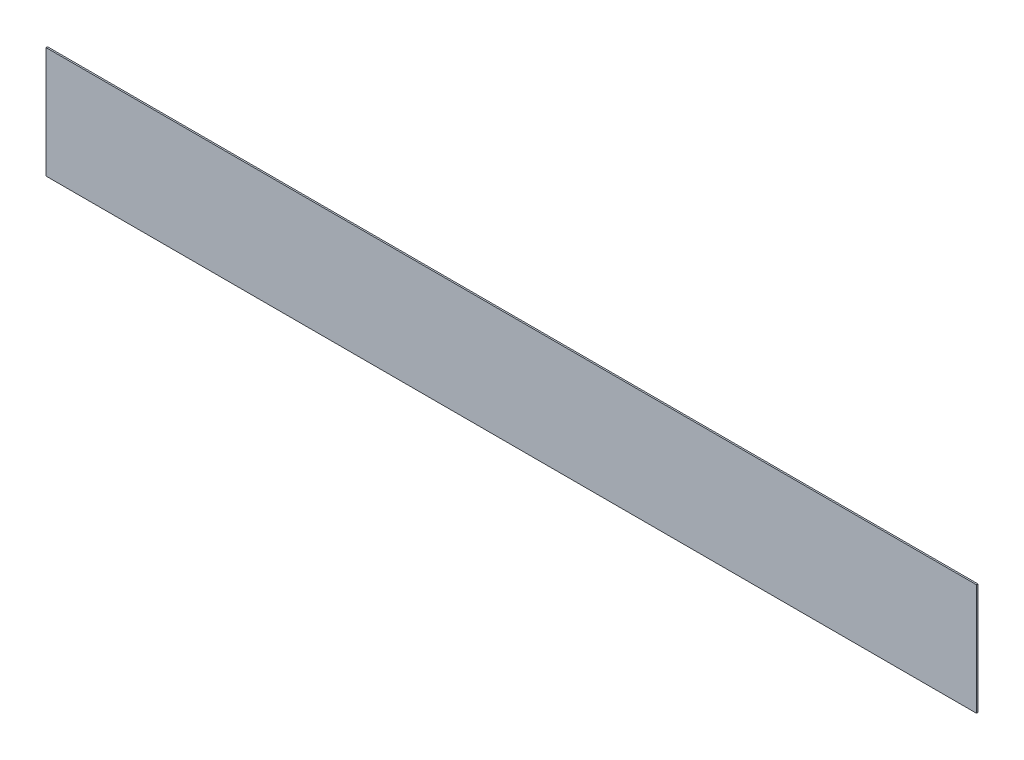
ISO-10303-21;
HEADER;
FILE_DESCRIPTION(('STEP AP214'),'2;1');
FILE_NAME('part.step','',(''),(''),'','','');
FILE_SCHEMA(('AUTOMOTIVE_DESIGN { 1 0 10303 214 1 1 1 1 }'));
ENDSEC;
DATA;
#1=APPLICATION_CONTEXT('core data for automotive mechanical design processes');
#2=APPLICATION_PROTOCOL_DEFINITION('international standard','automotive_design',2000,#1);
#3=PRODUCT_CONTEXT('',#1,'mechanical');
#4=PRODUCT('Part','Part','',(#3));
#5=PRODUCT_RELATED_PRODUCT_CATEGORY('part','',(#4));
#6=PRODUCT_DEFINITION_FORMATION('','',#4);
#7=PRODUCT_DEFINITION_CONTEXT('part definition',#1,'design');
#8=PRODUCT_DEFINITION('design','',#6,#7);
#9=PRODUCT_DEFINITION_SHAPE('','',#8);
#10=(LENGTH_UNIT() NAMED_UNIT(*) SI_UNIT(.MILLI.,.METRE.));
#11=(NAMED_UNIT(*) PLANE_ANGLE_UNIT() SI_UNIT($,.RADIAN.));
#12=(NAMED_UNIT(*) SI_UNIT($,.STERADIAN.) SOLID_ANGLE_UNIT());
#13=UNCERTAINTY_MEASURE_WITH_UNIT(LENGTH_MEASURE(1.E-05),#10,'distance_accuracy_value','');
#14=(GEOMETRIC_REPRESENTATION_CONTEXT(3) GLOBAL_UNCERTAINTY_ASSIGNED_CONTEXT((#13)) GLOBAL_UNIT_ASSIGNED_CONTEXT((#10,
#11,#12)) REPRESENTATION_CONTEXT('',''));
#15=CARTESIAN_POINT('',(0.,0.,0.));
#16=DIRECTION('',(0.,0.,1.));
#17=DIRECTION('',(1.,0.,0.));
#18=AXIS2_PLACEMENT_3D('',#15,#16,#17);
#19=CARTESIAN_POINT('',(-1254.,150.,4.));
#20=DIRECTION('',(1.,0.,0.));
#21=DIRECTION('',(0.,0.,-1.));
#22=AXIS2_PLACEMENT_3D('',#19,#20,#21);
#23=PLANE('',#22);
#24=DIRECTION('',(0.,-1.,0.));
#25=VECTOR('',#24,1.);
#26=CARTESIAN_POINT('',(-1254.,150.,0.));
#27=LINE('',#26,#25);
#28=CARTESIAN_POINT('',(-1254.,150.,0.));
#29=VERTEX_POINT('',#28);
#30=CARTESIAN_POINT('',(-1254.,-150.,0.));
#31=VERTEX_POINT('',#30);
#32=EDGE_CURVE('E97',#29,#31,#27,.T.);
#33=ORIENTED_EDGE('',*,*,#32,.T.);
#34=DIRECTION('',(0.,0.,-1.));
#35=VECTOR('',#34,1.);
#36=CARTESIAN_POINT('',(-1254.,-150.,4.));
#37=LINE('',#36,#35);
#38=CARTESIAN_POINT('',(-1254.,-150.,4.));
#39=VERTEX_POINT('',#38);
#40=EDGE_CURVE('E11',#39,#31,#37,.T.);
#41=ORIENTED_EDGE('',*,*,#40,.F.);
#42=DIRECTION('',(0.,-1.,0.));
#43=VECTOR('',#42,1.);
#44=CARTESIAN_POINT('',(-1254.,150.,4.));
#45=LINE('',#44,#43);
#46=CARTESIAN_POINT('',(-1254.,150.,4.));
#47=VERTEX_POINT('',#46);
#48=EDGE_CURVE('E85',#47,#39,#45,.T.);
#49=ORIENTED_EDGE('',*,*,#48,.F.);
#50=DIRECTION('',(0.,0.,-1.));
#51=VECTOR('',#50,1.);
#52=CARTESIAN_POINT('',(-1254.,150.,4.));
#53=LINE('',#52,#51);
#54=EDGE_CURVE('E93',#47,#29,#53,.T.);
#55=ORIENTED_EDGE('',*,*,#54,.T.);
#56=EDGE_LOOP('',(#33,#41,#49,#55));
#57=FACE_BOUND('',#56,.T.);
#58=ADVANCED_FACE('F34',(#57),#23,.F.);
#59=CARTESIAN_POINT('',(-1254.,-150.,4.));
#60=DIRECTION('',(0.,1.,0.));
#61=DIRECTION('',(0.,0.,1.));
#62=AXIS2_PLACEMENT_3D('',#59,#60,#61);
#63=PLANE('',#62);
#64=DIRECTION('',(1.,0.,0.));
#65=VECTOR('',#64,1.);
#66=CARTESIAN_POINT('',(-1254.,-150.,0.));
#67=LINE('',#66,#65);
#68=CARTESIAN_POINT('',(1254.,-150.,0.));
#69=VERTEX_POINT('',#68);
#70=EDGE_CURVE('E89',#31,#69,#67,.T.);
#71=ORIENTED_EDGE('',*,*,#70,.T.);
#72=DIRECTION('',(0.,0.,-1.));
#73=VECTOR('',#72,1.);
#74=CARTESIAN_POINT('',(1254.,-150.,4.));
#75=LINE('',#74,#73);
#76=CARTESIAN_POINT('',(1254.,-150.,4.));
#77=VERTEX_POINT('',#76);
#78=EDGE_CURVE('E42',#77,#69,#75,.T.);
#79=ORIENTED_EDGE('',*,*,#78,.F.);
#80=DIRECTION('',(1.,0.,0.));
#81=VECTOR('',#80,1.);
#82=CARTESIAN_POINT('',(-1254.,-150.,4.));
#83=LINE('',#82,#81);
#84=EDGE_CURVE('E80',#39,#77,#83,.T.);
#85=ORIENTED_EDGE('',*,*,#84,.F.);
#86=ORIENTED_EDGE('',*,*,#40,.T.);
#87=EDGE_LOOP('',(#71,#79,#85,#86));
#88=FACE_BOUND('',#87,.T.);
#89=ADVANCED_FACE('F88',(#88),#63,.F.);
#90=CARTESIAN_POINT('',(1254.,150.,4.));
#91=DIRECTION('',(-1.,0.,0.));
#92=DIRECTION('',(0.,0.,1.));
#93=AXIS2_PLACEMENT_3D('',#90,#91,#92);
#94=PLANE('',#93);
#95=DIRECTION('',(0.,1.,0.));
#96=VECTOR('',#95,1.);
#97=CARTESIAN_POINT('',(1254.,150.,0.));
#98=LINE('',#97,#96);
#99=CARTESIAN_POINT('',(1254.,150.,0.));
#100=VERTEX_POINT('',#99);
#101=EDGE_CURVE('E67',#69,#100,#98,.T.);
#102=ORIENTED_EDGE('',*,*,#101,.T.);
#103=DIRECTION('',(0.,0.,-1.));
#104=VECTOR('',#103,1.);
#105=CARTESIAN_POINT('',(1254.,150.,4.));
#106=LINE('',#105,#104);
#107=CARTESIAN_POINT('',(1254.,150.,4.));
#108=VERTEX_POINT('',#107);
#109=EDGE_CURVE('E90',#108,#100,#106,.T.);
#110=ORIENTED_EDGE('',*,*,#109,.F.);
#111=DIRECTION('',(0.,1.,0.));
#112=VECTOR('',#111,1.);
#113=CARTESIAN_POINT('',(1254.,150.,4.));
#114=LINE('',#113,#112);
#115=EDGE_CURVE('E83',#77,#108,#114,.T.);
#116=ORIENTED_EDGE('',*,*,#115,.F.);
#117=ORIENTED_EDGE('',*,*,#78,.T.);
#118=EDGE_LOOP('',(#102,#110,#116,#117));
#119=FACE_BOUND('',#118,.T.);
#120=ADVANCED_FACE('F91',(#119),#94,.F.);
#121=CARTESIAN_POINT('',(-1254.,150.,4.));
#122=DIRECTION('',(0.,-1.,0.));
#123=DIRECTION('',(0.,0.,-1.));
#124=AXIS2_PLACEMENT_3D('',#121,#122,#123);
#125=PLANE('',#124);
#126=DIRECTION('',(-1.,0.,0.));
#127=VECTOR('',#126,1.);
#128=CARTESIAN_POINT('',(-1254.,150.,0.));
#129=LINE('',#128,#127);
#130=EDGE_CURVE('E73',#100,#29,#129,.T.);
#131=ORIENTED_EDGE('',*,*,#130,.T.);
#132=ORIENTED_EDGE('',*,*,#54,.F.);
#133=DIRECTION('',(-1.,0.,0.));
#134=VECTOR('',#133,1.);
#135=CARTESIAN_POINT('',(-1254.,150.,4.));
#136=LINE('',#135,#134);
#137=EDGE_CURVE('E50',#108,#47,#136,.T.);
#138=ORIENTED_EDGE('',*,*,#137,.F.);
#139=ORIENTED_EDGE('',*,*,#109,.T.);
#140=EDGE_LOOP('',(#131,#132,#138,#139));
#141=FACE_BOUND('',#140,.T.);
#142=ADVANCED_FACE('F104',(#141),#125,.F.);
#143=CARTESIAN_POINT('',(0.,0.,4.));
#144=DIRECTION('',(0.,0.,1.));
#145=DIRECTION('',(1.,0.,0.));
#146=AXIS2_PLACEMENT_3D('',#143,#144,#145);
#147=PLANE('',#146);
#148=ORIENTED_EDGE('',*,*,#48,.T.);
#149=ORIENTED_EDGE('',*,*,#84,.T.);
#150=ORIENTED_EDGE('',*,*,#115,.T.);
#151=ORIENTED_EDGE('',*,*,#137,.T.);
#152=EDGE_LOOP('',(#148,#149,#150,#151));
#153=FACE_BOUND('',#152,.T.);
#154=ADVANCED_FACE('F81',(#153),#147,.T.);
#155=CARTESIAN_POINT('',(0.,0.,0.));
#156=DIRECTION('',(0.,0.,1.));
#157=DIRECTION('',(1.,0.,0.));
#158=AXIS2_PLACEMENT_3D('',#155,#156,#157);
#159=PLANE('',#158);
#160=ORIENTED_EDGE('',*,*,#32,.F.);
#161=ORIENTED_EDGE('',*,*,#130,.F.);
#162=ORIENTED_EDGE('',*,*,#101,.F.);
#163=ORIENTED_EDGE('',*,*,#70,.F.);
#164=EDGE_LOOP('',(#160,#161,#162,#163));
#165=FACE_BOUND('',#164,.T.);
#166=ADVANCED_FACE('F107',(#165),#159,.F.);
#167=CLOSED_SHELL('',(#58,#89,#120,#142,#154,#166));
#168=MANIFOLD_SOLID_BREP('B2',#167);
#169=ADVANCED_BREP_SHAPE_REPRESENTATION('',(#18,#168),#14);
#170=SHAPE_DEFINITION_REPRESENTATION(#9,#169);
ENDSEC;
END-ISO-10303-21;
